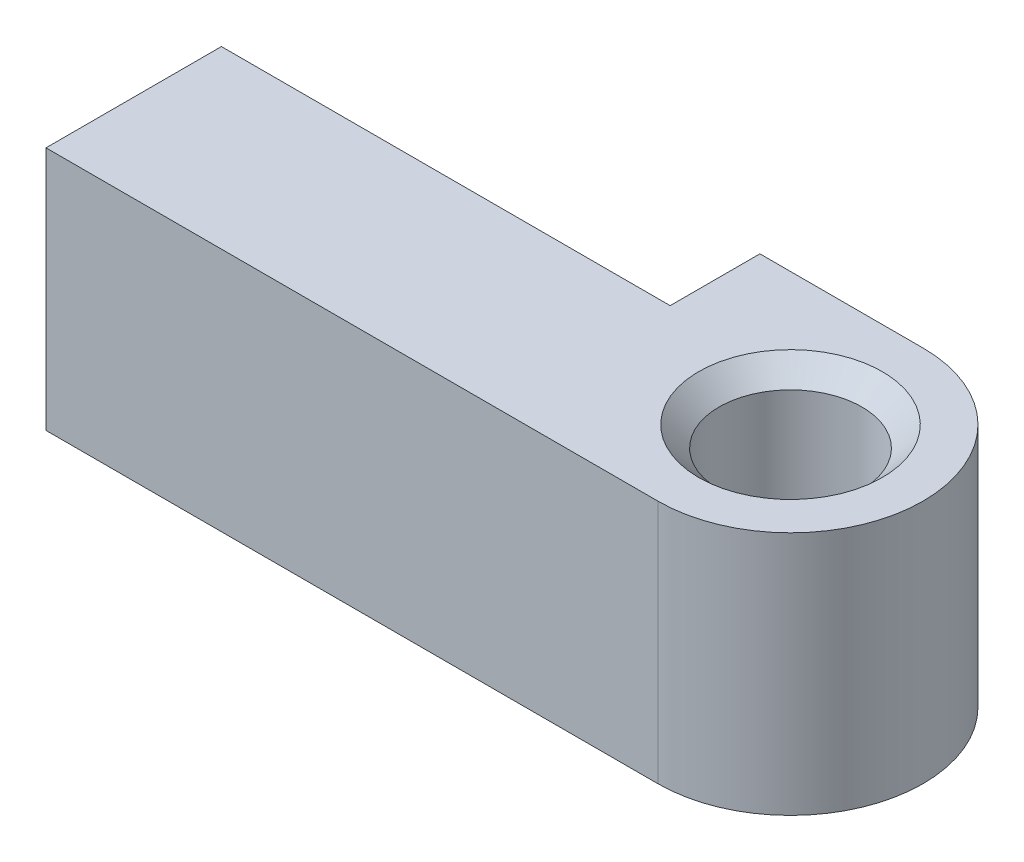
ISO-10303-21;
HEADER;
FILE_DESCRIPTION(('STEP AP214'),'2;1');
FILE_NAME('part.step','',(''),(''),'','','');
FILE_SCHEMA(('AUTOMOTIVE_DESIGN { 1 0 10303 214 1 1 1 1 }'));
ENDSEC;
DATA;
#1=APPLICATION_CONTEXT('core data for automotive mechanical design processes');
#2=APPLICATION_PROTOCOL_DEFINITION('international standard','automotive_design',2000,#1);
#3=PRODUCT_CONTEXT('',#1,'mechanical');
#4=PRODUCT('Part','Part','',(#3));
#5=PRODUCT_RELATED_PRODUCT_CATEGORY('part','',(#4));
#6=PRODUCT_DEFINITION_FORMATION('','',#4);
#7=PRODUCT_DEFINITION_CONTEXT('part definition',#1,'design');
#8=PRODUCT_DEFINITION('design','',#6,#7);
#9=PRODUCT_DEFINITION_SHAPE('','',#8);
#10=(LENGTH_UNIT() NAMED_UNIT(*) SI_UNIT(.MILLI.,.METRE.));
#11=(NAMED_UNIT(*) PLANE_ANGLE_UNIT() SI_UNIT($,.RADIAN.));
#12=(NAMED_UNIT(*) SI_UNIT($,.STERADIAN.) SOLID_ANGLE_UNIT());
#13=UNCERTAINTY_MEASURE_WITH_UNIT(LENGTH_MEASURE(1.E-05),#10,'distance_accuracy_value','');
#14=(GEOMETRIC_REPRESENTATION_CONTEXT(3) GLOBAL_UNCERTAINTY_ASSIGNED_CONTEXT((#13)) GLOBAL_UNIT_ASSIGNED_CONTEXT((#10,
#11,#12)) REPRESENTATION_CONTEXT('',''));
#15=CARTESIAN_POINT('',(0.,0.,0.));
#16=DIRECTION('',(0.,0.,1.));
#17=DIRECTION('',(1.,0.,0.));
#18=AXIS2_PLACEMENT_3D('',#15,#16,#17);
#19=CARTESIAN_POINT('',(15.,6.,1.05));
#20=DIRECTION('',(0.,1.,0.));
#21=DIRECTION('',(0.,0.,1.));
#22=AXIS2_PLACEMENT_3D('',#19,#20,#21);
#23=PLANE('',#22);
#24=CARTESIAN_POINT('',(15.,6.,1.05));
#25=DIRECTION('',(0.,1.,0.));
#26=DIRECTION('',(0.,0.,1.));
#27=AXIS2_PLACEMENT_3D('',#24,#25,#26);
#28=CIRCLE('',#27,2.25000000000001);
#29=CARTESIAN_POINT('',(15.,6.,3.30000000000001));
#30=VERTEX_POINT('',#29);
#31=EDGE_CURVE('E11',#30,#30,#28,.F.);
#32=ORIENTED_EDGE('',*,*,#31,.T.);
#33=EDGE_LOOP('',(#32));
#34=FACE_BOUND('',#33,.T.);
#35=CARTESIAN_POINT('',(15.,6.,1.05));
#36=DIRECTION('',(0.,1.,0.));
#37=DIRECTION('',(0.,0.,1.));
#38=AXIS2_PLACEMENT_3D('',#35,#36,#37);
#39=CIRCLE('',#38,3.25);
#40=CARTESIAN_POINT('',(15.,6.,4.3));
#41=VERTEX_POINT('',#40);
#42=CARTESIAN_POINT('',(15.,6.,-2.2));
#43=VERTEX_POINT('',#42);
#44=EDGE_CURVE('E140',#41,#43,#39,.T.);
#45=ORIENTED_EDGE('',*,*,#44,.T.);
#46=DIRECTION('',(-1.,0.,0.));
#47=VECTOR('',#46,1.);
#48=CARTESIAN_POINT('',(11.,6.,-2.2));
#49=LINE('',#48,#47);
#50=CARTESIAN_POINT('',(11.,6.,-2.2));
#51=VERTEX_POINT('',#50);
#52=EDGE_CURVE('E100',#43,#51,#49,.T.);
#53=ORIENTED_EDGE('',*,*,#52,.T.);
#54=DIRECTION('',(0.,0.,1.));
#55=VECTOR('',#54,1.);
#56=CARTESIAN_POINT('',(11.,6.,-2.2));
#57=LINE('',#56,#55);
#58=CARTESIAN_POINT('',(11.,6.,0.));
#59=VERTEX_POINT('',#58);
#60=EDGE_CURVE('E108',#51,#59,#57,.T.);
#61=ORIENTED_EDGE('',*,*,#60,.T.);
#62=DIRECTION('',(-1.,0.,0.));
#63=VECTOR('',#62,1.);
#64=CARTESIAN_POINT('',(0.,6.,0.));
#65=LINE('',#64,#63);
#66=CARTESIAN_POINT('',(0.,6.,0.));
#67=VERTEX_POINT('',#66);
#68=EDGE_CURVE('E102',#59,#67,#65,.T.);
#69=ORIENTED_EDGE('',*,*,#68,.T.);
#70=DIRECTION('',(0.,0.,1.));
#71=VECTOR('',#70,1.);
#72=CARTESIAN_POINT('',(0.,6.,0.));
#73=LINE('',#72,#71);
#74=CARTESIAN_POINT('',(0.,6.,4.3));
#75=VERTEX_POINT('',#74);
#76=EDGE_CURVE('E110',#67,#75,#73,.T.);
#77=ORIENTED_EDGE('',*,*,#76,.T.);
#78=DIRECTION('',(1.,0.,0.));
#79=VECTOR('',#78,1.);
#80=CARTESIAN_POINT('',(0.,6.,4.3));
#81=LINE('',#80,#79);
#82=EDGE_CURVE('E56',#75,#41,#81,.T.);
#83=ORIENTED_EDGE('',*,*,#82,.T.);
#84=EDGE_LOOP('',(#45,#53,#61,#69,#77,#83));
#85=FACE_BOUND('',#84,.T.);
#86=ADVANCED_FACE('F41',(#34,#85),#23,.T.);
#87=CARTESIAN_POINT('',(15.,0.,1.05));
#88=DIRECTION('',(0.,1.,0.));
#89=DIRECTION('',(0.,0.,1.));
#90=AXIS2_PLACEMENT_3D('',#87,#88,#89);
#91=PLANE('',#90);
#92=CARTESIAN_POINT('',(15.,0.,1.05));
#93=DIRECTION('',(0.,1.,0.));
#94=DIRECTION('',(0.,0.,1.));
#95=AXIS2_PLACEMENT_3D('',#92,#93,#94);
#96=CIRCLE('',#95,3.25);
#97=CARTESIAN_POINT('',(15.,0.,4.3));
#98=VERTEX_POINT('',#97);
#99=CARTESIAN_POINT('',(15.,0.,-2.2));
#100=VERTEX_POINT('',#99);
#101=EDGE_CURVE('E130',#98,#100,#96,.T.);
#102=ORIENTED_EDGE('',*,*,#101,.F.);
#103=DIRECTION('',(1.,0.,0.));
#104=VECTOR('',#103,1.);
#105=CARTESIAN_POINT('',(0.,0.,4.3));
#106=LINE('',#105,#104);
#107=CARTESIAN_POINT('',(0.,0.,4.3));
#108=VERTEX_POINT('',#107);
#109=EDGE_CURVE('E86',#108,#98,#106,.T.);
#110=ORIENTED_EDGE('',*,*,#109,.F.);
#111=DIRECTION('',(0.,0.,1.));
#112=VECTOR('',#111,1.);
#113=CARTESIAN_POINT('',(0.,0.,0.));
#114=LINE('',#113,#112);
#115=CARTESIAN_POINT('',(0.,0.,0.));
#116=VERTEX_POINT('',#115);
#117=EDGE_CURVE('E81',#116,#108,#114,.T.);
#118=ORIENTED_EDGE('',*,*,#117,.F.);
#119=DIRECTION('',(-1.,0.,0.));
#120=VECTOR('',#119,1.);
#121=CARTESIAN_POINT('',(0.,0.,0.));
#122=LINE('',#121,#120);
#123=CARTESIAN_POINT('',(11.,0.,0.));
#124=VERTEX_POINT('',#123);
#125=EDGE_CURVE('E120',#124,#116,#122,.T.);
#126=ORIENTED_EDGE('',*,*,#125,.F.);
#127=DIRECTION('',(0.,0.,1.));
#128=VECTOR('',#127,1.);
#129=CARTESIAN_POINT('',(11.,0.,-2.2));
#130=LINE('',#129,#128);
#131=CARTESIAN_POINT('',(11.,0.,-2.2));
#132=VERTEX_POINT('',#131);
#133=EDGE_CURVE('E134',#132,#124,#130,.T.);
#134=ORIENTED_EDGE('',*,*,#133,.F.);
#135=DIRECTION('',(-1.,0.,0.));
#136=VECTOR('',#135,1.);
#137=CARTESIAN_POINT('',(11.,0.,-2.2));
#138=LINE('',#137,#136);
#139=EDGE_CURVE('E128',#100,#132,#138,.T.);
#140=ORIENTED_EDGE('',*,*,#139,.F.);
#141=EDGE_LOOP('',(#102,#110,#118,#126,#134,#140));
#142=FACE_BOUND('',#141,.T.);
#143=CARTESIAN_POINT('',(15.,0.,1.05));
#144=DIRECTION('',(0.,1.,0.));
#145=DIRECTION('',(0.,0.,1.));
#146=AXIS2_PLACEMENT_3D('',#143,#144,#145);
#147=CIRCLE('',#146,1.75);
#148=CARTESIAN_POINT('',(15.,0.,2.8));
#149=VERTEX_POINT('',#148);
#150=EDGE_CURVE('E132',#149,#149,#147,.T.);
#151=ORIENTED_EDGE('',*,*,#150,.T.);
#152=EDGE_LOOP('',(#151));
#153=FACE_BOUND('',#152,.T.);
#154=ADVANCED_FACE('F161',(#142,#153),#91,.F.);
#155=CARTESIAN_POINT('',(15.,6.,1.05));
#156=DIRECTION('',(0.,-1.,0.));
#157=DIRECTION('',(0.,0.,-1.));
#158=AXIS2_PLACEMENT_3D('',#155,#156,#157);
#159=CYLINDRICAL_SURFACE('',#158,3.25);
#160=ORIENTED_EDGE('',*,*,#101,.T.);
#161=DIRECTION('',(0.,-1.,0.));
#162=VECTOR('',#161,1.);
#163=CARTESIAN_POINT('',(15.,6.,-2.2));
#164=LINE('',#163,#162);
#165=EDGE_CURVE('E144',#43,#100,#164,.T.);
#166=ORIENTED_EDGE('',*,*,#165,.F.);
#167=ORIENTED_EDGE('',*,*,#44,.F.);
#168=DIRECTION('',(0.,-1.,0.));
#169=VECTOR('',#168,1.);
#170=CARTESIAN_POINT('',(15.,6.,4.3));
#171=LINE('',#170,#169);
#172=EDGE_CURVE('E125',#41,#98,#171,.T.);
#173=ORIENTED_EDGE('',*,*,#172,.T.);
#174=EDGE_LOOP('',(#160,#166,#167,#173));
#175=FACE_BOUND('',#174,.T.);
#176=ADVANCED_FACE('F169',(#175),#159,.T.);
#177=CARTESIAN_POINT('',(11.,6.,-2.2));
#178=DIRECTION('',(0.,0.,1.));
#179=DIRECTION('',(1.,0.,0.));
#180=AXIS2_PLACEMENT_3D('',#177,#178,#179);
#181=PLANE('',#180);
#182=ORIENTED_EDGE('',*,*,#139,.T.);
#183=DIRECTION('',(0.,-1.,0.));
#184=VECTOR('',#183,1.);
#185=CARTESIAN_POINT('',(11.,6.,-2.2));
#186=LINE('',#185,#184);
#187=EDGE_CURVE('E142',#51,#132,#186,.T.);
#188=ORIENTED_EDGE('',*,*,#187,.F.);
#189=ORIENTED_EDGE('',*,*,#52,.F.);
#190=ORIENTED_EDGE('',*,*,#165,.T.);
#191=EDGE_LOOP('',(#182,#188,#189,#190));
#192=FACE_BOUND('',#191,.T.);
#193=ADVANCED_FACE('F177',(#192),#181,.F.);
#194=CARTESIAN_POINT('',(11.,6.,-2.2));
#195=DIRECTION('',(1.,0.,0.));
#196=DIRECTION('',(0.,0.,-1.));
#197=AXIS2_PLACEMENT_3D('',#194,#195,#196);
#198=PLANE('',#197);
#199=ORIENTED_EDGE('',*,*,#133,.T.);
#200=DIRECTION('',(0.,-1.,0.));
#201=VECTOR('',#200,1.);
#202=CARTESIAN_POINT('',(11.,6.,0.));
#203=LINE('',#202,#201);
#204=EDGE_CURVE('E119',#59,#124,#203,.T.);
#205=ORIENTED_EDGE('',*,*,#204,.F.);
#206=ORIENTED_EDGE('',*,*,#60,.F.);
#207=ORIENTED_EDGE('',*,*,#187,.T.);
#208=EDGE_LOOP('',(#199,#205,#206,#207));
#209=FACE_BOUND('',#208,.T.);
#210=ADVANCED_FACE('F176',(#209),#198,.F.);
#211=CARTESIAN_POINT('',(0.,6.,0.));
#212=DIRECTION('',(0.,0.,1.));
#213=DIRECTION('',(1.,0.,0.));
#214=AXIS2_PLACEMENT_3D('',#211,#212,#213);
#215=PLANE('',#214);
#216=ORIENTED_EDGE('',*,*,#125,.T.);
#217=DIRECTION('',(0.,-1.,0.));
#218=VECTOR('',#217,1.);
#219=CARTESIAN_POINT('',(0.,6.,0.));
#220=LINE('',#219,#218);
#221=EDGE_CURVE('E111',#67,#116,#220,.T.);
#222=ORIENTED_EDGE('',*,*,#221,.F.);
#223=ORIENTED_EDGE('',*,*,#68,.F.);
#224=ORIENTED_EDGE('',*,*,#204,.T.);
#225=EDGE_LOOP('',(#216,#222,#223,#224));
#226=FACE_BOUND('',#225,.T.);
#227=ADVANCED_FACE('F113',(#226),#215,.F.);
#228=CARTESIAN_POINT('',(0.,6.,0.));
#229=DIRECTION('',(1.,0.,0.));
#230=DIRECTION('',(0.,0.,-1.));
#231=AXIS2_PLACEMENT_3D('',#228,#229,#230);
#232=PLANE('',#231);
#233=ORIENTED_EDGE('',*,*,#117,.T.);
#234=DIRECTION('',(0.,-1.,0.));
#235=VECTOR('',#234,1.);
#236=CARTESIAN_POINT('',(0.,6.,4.3));
#237=LINE('',#236,#235);
#238=EDGE_CURVE('E116',#75,#108,#237,.T.);
#239=ORIENTED_EDGE('',*,*,#238,.F.);
#240=ORIENTED_EDGE('',*,*,#76,.F.);
#241=ORIENTED_EDGE('',*,*,#221,.T.);
#242=EDGE_LOOP('',(#233,#239,#240,#241));
#243=FACE_BOUND('',#242,.T.);
#244=ADVANCED_FACE('F124',(#243),#232,.F.);
#245=CARTESIAN_POINT('',(0.,6.,4.3));
#246=DIRECTION('',(0.,0.,-1.));
#247=DIRECTION('',(-1.,0.,0.));
#248=AXIS2_PLACEMENT_3D('',#245,#246,#247);
#249=PLANE('',#248);
#250=ORIENTED_EDGE('',*,*,#109,.T.);
#251=ORIENTED_EDGE('',*,*,#172,.F.);
#252=ORIENTED_EDGE('',*,*,#82,.F.);
#253=ORIENTED_EDGE('',*,*,#238,.T.);
#254=EDGE_LOOP('',(#250,#251,#252,#253));
#255=FACE_BOUND('',#254,.T.);
#256=ADVANCED_FACE('F160',(#255),#249,.F.);
#257=CARTESIAN_POINT('',(15.,6.,1.05));
#258=DIRECTION('',(0.,-1.,0.));
#259=DIRECTION('',(0.,0.,-1.));
#260=AXIS2_PLACEMENT_3D('',#257,#258,#259);
#261=CYLINDRICAL_SURFACE('',#260,1.75);
#262=CARTESIAN_POINT('',(15.,5.49999999999999,1.05));
#263=DIRECTION('',(0.,1.,0.));
#264=DIRECTION('',(0.,0.,1.));
#265=AXIS2_PLACEMENT_3D('',#262,#263,#264);
#266=CIRCLE('',#265,1.75);
#267=CARTESIAN_POINT('',(15.,5.49999999999999,2.8));
#268=VERTEX_POINT('',#267);
#269=EDGE_CURVE('E51',#268,#268,#266,.T.);
#270=ORIENTED_EDGE('',*,*,#269,.T.);
#271=EDGE_LOOP('',(#270));
#272=FACE_BOUND('',#271,.T.);
#273=ORIENTED_EDGE('',*,*,#150,.F.);
#274=EDGE_LOOP('',(#273));
#275=FACE_BOUND('',#274,.T.);
#276=ADVANCED_FACE('F149',(#272,#275),#261,.F.);
#277=CARTESIAN_POINT('',(15.,5.49999999999999,1.05));
#278=DIRECTION('',(0.,1.,0.));
#279=DIRECTION('',(0.,0.,1.));
#280=AXIS2_PLACEMENT_3D('',#277,#278,#279);
#281=CONICAL_SURFACE('',#280,1.75,0.785398163397447);
#282=ORIENTED_EDGE('',*,*,#31,.F.);
#283=EDGE_LOOP('',(#282));
#284=FACE_BOUND('',#283,.T.);
#285=ORIENTED_EDGE('',*,*,#269,.F.);
#286=EDGE_LOOP('',(#285));
#287=FACE_BOUND('',#286,.T.);
#288=ADVANCED_FACE('F42',(#284,#287),#281,.F.);
#289=CLOSED_SHELL('',(#86,#154,#176,#193,#210,#227,#244,#256,#276,#288));
#290=MANIFOLD_SOLID_BREP('B2',#289);
#291=ADVANCED_BREP_SHAPE_REPRESENTATION('',(#18,#290),#14);
#292=SHAPE_DEFINITION_REPRESENTATION(#9,#291);
ENDSEC;
END-ISO-10303-21;
